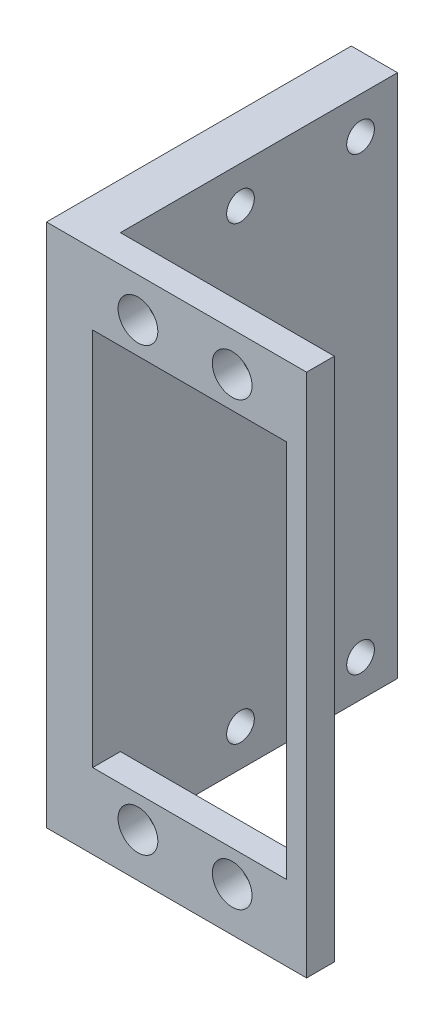
ISO-10303-21;
HEADER;
FILE_DESCRIPTION(('STEP AP214'),'2;1');
FILE_NAME('part.step','',(''),(''),'','','');
FILE_SCHEMA(('AUTOMOTIVE_DESIGN { 1 0 10303 214 1 1 1 1 }'));
ENDSEC;
DATA;
#1=APPLICATION_CONTEXT('core data for automotive mechanical design processes');
#2=APPLICATION_PROTOCOL_DEFINITION('international standard','automotive_design',2000,#1);
#3=PRODUCT_CONTEXT('',#1,'mechanical');
#4=PRODUCT('Part','Part','',(#3));
#5=PRODUCT_RELATED_PRODUCT_CATEGORY('part','',(#4));
#6=PRODUCT_DEFINITION_FORMATION('','',#4);
#7=PRODUCT_DEFINITION_CONTEXT('part definition',#1,'design');
#8=PRODUCT_DEFINITION('design','',#6,#7);
#9=PRODUCT_DEFINITION_SHAPE('','',#8);
#10=(LENGTH_UNIT() NAMED_UNIT(*) SI_UNIT(.MILLI.,.METRE.));
#11=(NAMED_UNIT(*) PLANE_ANGLE_UNIT() SI_UNIT($,.RADIAN.));
#12=(NAMED_UNIT(*) SI_UNIT($,.STERADIAN.) SOLID_ANGLE_UNIT());
#13=UNCERTAINTY_MEASURE_WITH_UNIT(LENGTH_MEASURE(1.E-05),#10,'distance_accuracy_value','');
#14=(GEOMETRIC_REPRESENTATION_CONTEXT(3) GLOBAL_UNCERTAINTY_ASSIGNED_CONTEXT((#13)) GLOBAL_UNIT_ASSIGNED_CONTEXT((#10,
#11,#12)) REPRESENTATION_CONTEXT('',''));
#15=CARTESIAN_POINT('',(0.,0.,0.));
#16=DIRECTION('',(0.,0.,1.));
#17=DIRECTION('',(1.,0.,0.));
#18=AXIS2_PLACEMENT_3D('',#15,#16,#17);
#19=CARTESIAN_POINT('',(-11.4535216616645,17.6096788638023,3.));
#20=DIRECTION('',(0.,-1.,0.));
#21=DIRECTION('',(0.,0.,-1.));
#22=AXIS2_PLACEMENT_3D('',#19,#20,#21);
#23=PLANE('',#22);
#24=DIRECTION('',(-1.,0.,0.));
#25=VECTOR('',#24,1.);
#26=CARTESIAN_POINT('',(-11.4535216616645,17.6096788638023,0.));
#27=LINE('',#26,#25);
#28=CARTESIAN_POINT('',(11.7043655919531,17.6096788638023,0.));
#29=VERTEX_POINT('',#28);
#30=CARTESIAN_POINT('',(-11.4535216616645,17.6096788638023,0.));
#31=VERTEX_POINT('',#30);
#32=EDGE_CURVE('E90',#29,#31,#27,.T.);
#33=ORIENTED_EDGE('',*,*,#32,.T.);
#34=DIRECTION('',(0.,0.,-1.));
#35=VECTOR('',#34,1.);
#36=CARTESIAN_POINT('',(-11.4535216616645,17.6096788638023,3.));
#37=LINE('',#36,#35);
#38=CARTESIAN_POINT('',(-11.4535216616645,17.6096788638023,-30.));
#39=VERTEX_POINT('',#38);
#40=EDGE_CURVE('E172',#31,#39,#37,.T.);
#41=ORIENTED_EDGE('',*,*,#40,.T.);
#42=DIRECTION('',(1.,0.,0.));
#43=VECTOR('',#42,1.);
#44=CARTESIAN_POINT('',(-11.4535216616645,17.6096788638023,-30.));
#45=LINE('',#44,#43);
#46=CARTESIAN_POINT('',(-16.4535216616645,17.6096788638023,-30.));
#47=VERTEX_POINT('',#46);
#48=EDGE_CURVE('E162',#47,#39,#45,.T.);
#49=ORIENTED_EDGE('',*,*,#48,.F.);
#50=DIRECTION('',(0.,0.,-1.));
#51=VECTOR('',#50,1.);
#52=CARTESIAN_POINT('',(-16.4535216616645,17.6096788638023,3.));
#53=LINE('',#52,#51);
#54=CARTESIAN_POINT('',(-16.4535216616645,17.6096788638023,3.));
#55=VERTEX_POINT('',#54);
#56=EDGE_CURVE('E175',#55,#47,#53,.T.);
#57=ORIENTED_EDGE('',*,*,#56,.F.);
#58=DIRECTION('',(-1.,0.,0.));
#59=VECTOR('',#58,1.);
#60=CARTESIAN_POINT('',(-11.4535216616645,17.6096788638023,3.));
#61=LINE('',#60,#59);
#62=CARTESIAN_POINT('',(11.7043655919531,17.6096788638023,3.));
#63=VERTEX_POINT('',#62);
#64=EDGE_CURVE('E84',#63,#55,#61,.T.);
#65=ORIENTED_EDGE('',*,*,#64,.F.);
#66=DIRECTION('',(0.,0.,-1.));
#67=VECTOR('',#66,1.);
#68=CARTESIAN_POINT('',(11.7043655919531,17.6096788638023,3.));
#69=LINE('',#68,#67);
#70=EDGE_CURVE('E79',#63,#29,#69,.T.);
#71=ORIENTED_EDGE('',*,*,#70,.T.);
#72=EDGE_LOOP('',(#33,#41,#49,#57,#65,#71));
#73=FACE_BOUND('',#72,.T.);
#74=ADVANCED_FACE('F32',(#73),#23,.F.);
#75=CARTESIAN_POINT('',(-11.4535216616645,-39.1935902800227,3.));
#76=DIRECTION('',(0.,1.,0.));
#77=DIRECTION('',(0.,0.,1.));
#78=AXIS2_PLACEMENT_3D('',#75,#76,#77);
#79=PLANE('',#78);
#80=DIRECTION('',(1.,0.,0.));
#81=VECTOR('',#80,1.);
#82=CARTESIAN_POINT('',(-11.4535216616645,-39.1935902800227,0.));
#83=LINE('',#82,#81);
#84=CARTESIAN_POINT('',(-11.4535216616645,-39.1935902800227,0.));
#85=VERTEX_POINT('',#84);
#86=CARTESIAN_POINT('',(11.7043655919531,-39.1935902800227,0.));
#87=VERTEX_POINT('',#86);
#88=EDGE_CURVE('E85',#85,#87,#83,.T.);
#89=ORIENTED_EDGE('',*,*,#88,.T.);
#90=DIRECTION('',(0.,0.,-1.));
#91=VECTOR('',#90,1.);
#92=CARTESIAN_POINT('',(11.7043655919531,-39.1935902800227,3.));
#93=LINE('',#92,#91);
#94=CARTESIAN_POINT('',(11.7043655919531,-39.1935902800227,3.));
#95=VERTEX_POINT('',#94);
#96=EDGE_CURVE('E40',#95,#87,#93,.T.);
#97=ORIENTED_EDGE('',*,*,#96,.F.);
#98=DIRECTION('',(1.,0.,0.));
#99=VECTOR('',#98,1.);
#100=CARTESIAN_POINT('',(-11.4535216616645,-39.1935902800227,3.));
#101=LINE('',#100,#99);
#102=CARTESIAN_POINT('',(-16.4535216616645,-39.1935902800227,3.));
#103=VERTEX_POINT('',#102);
#104=EDGE_CURVE('E201',#103,#95,#101,.T.);
#105=ORIENTED_EDGE('',*,*,#104,.F.);
#106=DIRECTION('',(0.,0.,-1.));
#107=VECTOR('',#106,1.);
#108=CARTESIAN_POINT('',(-16.4535216616645,-39.1935902800227,3.));
#109=LINE('',#108,#107);
#110=CARTESIAN_POINT('',(-16.4535216616645,-39.1935902800227,-30.));
#111=VERTEX_POINT('',#110);
#112=EDGE_CURVE('E178',#103,#111,#109,.T.);
#113=ORIENTED_EDGE('',*,*,#112,.T.);
#114=DIRECTION('',(-1.,0.,0.));
#115=VECTOR('',#114,1.);
#116=CARTESIAN_POINT('',(-11.4535216616645,-39.1935902800227,-30.));
#117=LINE('',#116,#115);
#118=CARTESIAN_POINT('',(-11.4535216616645,-39.1935902800227,-30.));
#119=VERTEX_POINT('',#118);
#120=EDGE_CURVE('E156',#119,#111,#117,.T.);
#121=ORIENTED_EDGE('',*,*,#120,.F.);
#122=DIRECTION('',(0.,0.,-1.));
#123=VECTOR('',#122,1.);
#124=CARTESIAN_POINT('',(-11.4535216616645,-39.1935902800227,3.));
#125=LINE('',#124,#123);
#126=EDGE_CURVE('E171',#85,#119,#125,.T.);
#127=ORIENTED_EDGE('',*,*,#126,.F.);
#128=EDGE_LOOP('',(#89,#97,#105,#113,#121,#127));
#129=FACE_BOUND('',#128,.T.);
#130=ADVANCED_FACE('F208',(#129),#79,.F.);
#131=CARTESIAN_POINT('',(11.7043655919531,17.6096788638023,3.));
#132=DIRECTION('',(-1.,0.,0.));
#133=DIRECTION('',(0.,-1.,0.));
#134=AXIS2_PLACEMENT_3D('',#131,#132,#133);
#135=PLANE('',#134);
#136=DIRECTION('',(0.,1.,0.));
#137=VECTOR('',#136,1.);
#138=CARTESIAN_POINT('',(11.7043655919531,17.6096788638023,0.));
#139=LINE('',#138,#137);
#140=EDGE_CURVE('E76',#87,#29,#139,.T.);
#141=ORIENTED_EDGE('',*,*,#140,.T.);
#142=ORIENTED_EDGE('',*,*,#70,.F.);
#143=DIRECTION('',(0.,1.,0.));
#144=VECTOR('',#143,1.);
#145=CARTESIAN_POINT('',(11.7043655919531,17.6096788638023,3.));
#146=LINE('',#145,#144);
#147=EDGE_CURVE('E57',#95,#63,#146,.T.);
#148=ORIENTED_EDGE('',*,*,#147,.F.);
#149=ORIENTED_EDGE('',*,*,#96,.T.);
#150=EDGE_LOOP('',(#141,#142,#148,#149));
#151=FACE_BOUND('',#150,.T.);
#152=ADVANCED_FACE('F78',(#151),#135,.F.);
#153=CARTESIAN_POINT('',(0.,0.,3.));
#154=DIRECTION('',(0.,0.,-1.));
#155=DIRECTION('',(-1.,0.,0.));
#156=AXIS2_PLACEMENT_3D('',#153,#154,#155);
#157=PLANE('',#156);
#158=CARTESIAN_POINT('',(-6.55352166166445,13.3725715818765,3.));
#159=DIRECTION('',(0.,0.,-1.));
#160=DIRECTION('',(-1.,0.,0.));
#161=AXIS2_PLACEMENT_3D('',#158,#159,#160);
#162=CIRCLE('',#161,2.15);
#163=CARTESIAN_POINT('',(-8.70352166166446,13.3725715818765,3.));
#164=VERTEX_POINT('',#163);
#165=EDGE_CURVE('E150',#164,#164,#162,.T.);
#166=ORIENTED_EDGE('',*,*,#165,.T.);
#167=EDGE_LOOP('',(#166));
#168=FACE_BOUND('',#167,.T.);
#169=CARTESIAN_POINT('',(3.64647833833554,-34.4274284181235,3.));
#170=DIRECTION('',(0.,0.,-1.));
#171=DIRECTION('',(-1.,0.,0.));
#172=AXIS2_PLACEMENT_3D('',#169,#170,#171);
#173=CIRCLE('',#172,2.15);
#174=CARTESIAN_POINT('',(1.49647833833555,-34.4274284181235,3.));
#175=VERTEX_POINT('',#174);
#176=EDGE_CURVE('E147',#175,#175,#173,.T.);
#177=ORIENTED_EDGE('',*,*,#176,.T.);
#178=EDGE_LOOP('',(#177));
#179=FACE_BOUND('',#178,.T.);
#180=CARTESIAN_POINT('',(-6.55352166166446,-34.4274284181235,3.));
#181=DIRECTION('',(0.,0.,-1.));
#182=DIRECTION('',(-1.,0.,0.));
#183=AXIS2_PLACEMENT_3D('',#180,#181,#182);
#184=CIRCLE('',#183,2.15);
#185=CARTESIAN_POINT('',(-8.70352166166445,-34.4274284181235,3.));
#186=VERTEX_POINT('',#185);
#187=EDGE_CURVE('E144',#186,#186,#184,.T.);
#188=ORIENTED_EDGE('',*,*,#187,.T.);
#189=EDGE_LOOP('',(#188));
#190=FACE_BOUND('',#189,.T.);
#191=CARTESIAN_POINT('',(3.64647833833554,13.3725715818765,3.));
#192=DIRECTION('',(0.,0.,-1.));
#193=DIRECTION('',(-1.,0.,0.));
#194=AXIS2_PLACEMENT_3D('',#191,#192,#193);
#195=CIRCLE('',#194,2.15);
#196=CARTESIAN_POINT('',(1.49647833833554,13.3725715818765,3.));
#197=VERTEX_POINT('',#196);
#198=EDGE_CURVE('E141',#197,#197,#195,.T.);
#199=ORIENTED_EDGE('',*,*,#198,.T.);
#200=EDGE_LOOP('',(#199));
#201=FACE_BOUND('',#200,.T.);
#202=DIRECTION('',(0.,-1.,0.));
#203=VECTOR('',#202,1.);
#204=CARTESIAN_POINT('',(-11.4535216616645,-39.1935902800227,3.));
#205=LINE('',#204,#203);
#206=CARTESIAN_POINT('',(-11.4535216616645,9.98681562195004,3.));
#207=VERTEX_POINT('',#206);
#208=CARTESIAN_POINT('',(-11.4535216616645,-31.041672458197,3.));
#209=VERTEX_POINT('',#208);
#210=EDGE_CURVE('E165',#207,#209,#205,.T.);
#211=ORIENTED_EDGE('',*,*,#210,.F.);
#212=DIRECTION('',(-1.,0.,0.));
#213=VECTOR('',#212,1.);
#214=CARTESIAN_POINT('',(9.52875763391757,9.98681562195004,3.));
#215=LINE('',#214,#213);
#216=CARTESIAN_POINT('',(9.52875763391757,9.98681562195004,3.));
#217=VERTEX_POINT('',#216);
#218=EDGE_CURVE('E185',#217,#207,#215,.T.);
#219=ORIENTED_EDGE('',*,*,#218,.F.);
#220=DIRECTION('',(0.,1.,0.));
#221=VECTOR('',#220,1.);
#222=CARTESIAN_POINT('',(9.52875763391757,-31.041672458197,3.));
#223=LINE('',#222,#221);
#224=CARTESIAN_POINT('',(9.52875763391757,-31.041672458197,3.));
#225=VERTEX_POINT('',#224);
#226=EDGE_CURVE('E190',#225,#217,#223,.T.);
#227=ORIENTED_EDGE('',*,*,#226,.F.);
#228=DIRECTION('',(1.,0.,0.));
#229=VECTOR('',#228,1.);
#230=CARTESIAN_POINT('',(9.52875763391757,-31.041672458197,3.));
#231=LINE('',#230,#229);
#232=EDGE_CURVE('E174',#209,#225,#231,.T.);
#233=ORIENTED_EDGE('',*,*,#232,.F.);
#234=EDGE_LOOP('',(#211,#219,#227,#233));
#235=FACE_BOUND('',#234,.T.);
#236=ORIENTED_EDGE('',*,*,#64,.T.);
#237=DIRECTION('',(0.,1.,0.));
#238=VECTOR('',#237,1.);
#239=CARTESIAN_POINT('',(-16.4535216616645,-39.1935902800227,3.));
#240=LINE('',#239,#238);
#241=EDGE_CURVE('E168',#103,#55,#240,.T.);
#242=ORIENTED_EDGE('',*,*,#241,.F.);
#243=ORIENTED_EDGE('',*,*,#104,.T.);
#244=ORIENTED_EDGE('',*,*,#147,.T.);
#245=EDGE_LOOP('',(#236,#242,#243,#244));
#246=FACE_BOUND('',#245,.T.);
#247=ADVANCED_FACE('F204',(#168,#179,#190,#201,#235,#246),#157,.F.);
#248=CARTESIAN_POINT('',(0.,0.,0.));
#249=DIRECTION('',(0.,0.,-1.));
#250=DIRECTION('',(-1.,0.,0.));
#251=AXIS2_PLACEMENT_3D('',#248,#249,#250);
#252=PLANE('',#251);
#253=CARTESIAN_POINT('',(-6.55352166166445,13.3725715818765,0.));
#254=DIRECTION('',(0.,0.,-1.));
#255=DIRECTION('',(-1.,0.,0.));
#256=AXIS2_PLACEMENT_3D('',#253,#254,#255);
#257=CIRCLE('',#256,2.15);
#258=CARTESIAN_POINT('',(-8.70352166166446,13.3725715818765,0.));
#259=VERTEX_POINT('',#258);
#260=EDGE_CURVE('E131',#259,#259,#257,.T.);
#261=ORIENTED_EDGE('',*,*,#260,.F.);
#262=EDGE_LOOP('',(#261));
#263=FACE_BOUND('',#262,.T.);
#264=CARTESIAN_POINT('',(3.64647833833554,-34.4274284181235,0.));
#265=DIRECTION('',(0.,0.,-1.));
#266=DIRECTION('',(-1.,0.,0.));
#267=AXIS2_PLACEMENT_3D('',#264,#265,#266);
#268=CIRCLE('',#267,2.15);
#269=CARTESIAN_POINT('',(1.49647833833555,-34.4274284181235,0.));
#270=VERTEX_POINT('',#269);
#271=EDGE_CURVE('E126',#270,#270,#268,.T.);
#272=ORIENTED_EDGE('',*,*,#271,.F.);
#273=EDGE_LOOP('',(#272));
#274=FACE_BOUND('',#273,.T.);
#275=CARTESIAN_POINT('',(-6.55352166166446,-34.4274284181235,0.));
#276=DIRECTION('',(0.,0.,-1.));
#277=DIRECTION('',(-1.,0.,0.));
#278=AXIS2_PLACEMENT_3D('',#275,#276,#277);
#279=CIRCLE('',#278,2.15);
#280=CARTESIAN_POINT('',(-8.70352166166445,-34.4274284181235,0.));
#281=VERTEX_POINT('',#280);
#282=EDGE_CURVE('E122',#281,#281,#279,.T.);
#283=ORIENTED_EDGE('',*,*,#282,.F.);
#284=EDGE_LOOP('',(#283));
#285=FACE_BOUND('',#284,.T.);
#286=CARTESIAN_POINT('',(3.64647833833554,13.3725715818765,0.));
#287=DIRECTION('',(0.,0.,-1.));
#288=DIRECTION('',(-1.,0.,0.));
#289=AXIS2_PLACEMENT_3D('',#286,#287,#288);
#290=CIRCLE('',#289,2.15);
#291=CARTESIAN_POINT('',(1.49647833833554,13.3725715818765,0.));
#292=VERTEX_POINT('',#291);
#293=EDGE_CURVE('E137',#292,#292,#290,.T.);
#294=ORIENTED_EDGE('',*,*,#293,.F.);
#295=EDGE_LOOP('',(#294));
#296=FACE_BOUND('',#295,.T.);
#297=DIRECTION('',(-1.,0.,0.));
#298=VECTOR('',#297,1.);
#299=CARTESIAN_POINT('',(9.52875763391757,9.98681562195004,0.));
#300=LINE('',#299,#298);
#301=CARTESIAN_POINT('',(9.52875763391757,9.98681562195004,0.));
#302=VERTEX_POINT('',#301);
#303=CARTESIAN_POINT('',(-11.4535216616645,9.98681562195004,0.));
#304=VERTEX_POINT('',#303);
#305=EDGE_CURVE('E184',#302,#304,#300,.T.);
#306=ORIENTED_EDGE('',*,*,#305,.T.);
#307=DIRECTION('',(0.,-1.,0.));
#308=VECTOR('',#307,1.);
#309=CARTESIAN_POINT('',(-11.4535216616645,-39.1935902800227,0.));
#310=LINE('',#309,#308);
#311=EDGE_CURVE('E97',#31,#304,#310,.T.);
#312=ORIENTED_EDGE('',*,*,#311,.F.);
#313=ORIENTED_EDGE('',*,*,#32,.F.);
#314=ORIENTED_EDGE('',*,*,#140,.F.);
#315=ORIENTED_EDGE('',*,*,#88,.F.);
#316=CARTESIAN_POINT('',(-11.4535216616645,-31.041672458197,0.));
#317=VERTEX_POINT('',#316);
#318=EDGE_CURVE('E98',#317,#85,#310,.T.);
#319=ORIENTED_EDGE('',*,*,#318,.F.);
#320=DIRECTION('',(-1.,0.,0.));
#321=VECTOR('',#320,1.);
#322=CARTESIAN_POINT('',(0.,-31.041672458197,0.));
#323=LINE('',#322,#321);
#324=CARTESIAN_POINT('',(9.52875763391757,-31.041672458197,0.));
#325=VERTEX_POINT('',#324);
#326=EDGE_CURVE('E11',#325,#317,#323,.T.);
#327=ORIENTED_EDGE('',*,*,#326,.F.);
#328=DIRECTION('',(0.,1.,0.));
#329=VECTOR('',#328,1.);
#330=CARTESIAN_POINT('',(9.52875763391757,-31.041672458197,0.));
#331=LINE('',#330,#329);
#332=EDGE_CURVE('E48',#325,#302,#331,.T.);
#333=ORIENTED_EDGE('',*,*,#332,.T.);
#334=EDGE_LOOP('',(#306,#312,#313,#314,#315,#319,#327,#333));
#335=FACE_BOUND('',#334,.T.);
#336=ADVANCED_FACE('F95',(#263,#274,#285,#296,#335),#252,.T.);
#337=CARTESIAN_POINT('',(9.52875763391757,9.98681562195004,0.));
#338=DIRECTION('',(0.,1.,0.));
#339=DIRECTION('',(-1.,0.,0.));
#340=AXIS2_PLACEMENT_3D('',#337,#338,#339);
#341=PLANE('',#340);
#342=ORIENTED_EDGE('',*,*,#305,.F.);
#343=DIRECTION('',(0.,0.,1.));
#344=VECTOR('',#343,1.);
#345=CARTESIAN_POINT('',(9.52875763391757,9.98681562195004,0.));
#346=LINE('',#345,#344);
#347=EDGE_CURVE('E195',#302,#217,#346,.T.);
#348=ORIENTED_EDGE('',*,*,#347,.T.);
#349=ORIENTED_EDGE('',*,*,#218,.T.);
#350=DIRECTION('',(0.,0.,1.));
#351=VECTOR('',#350,1.);
#352=CARTESIAN_POINT('',(-11.4535216616645,9.98681562195004,3.));
#353=LINE('',#352,#351);
#354=EDGE_CURVE('E99',#304,#207,#353,.T.);
#355=ORIENTED_EDGE('',*,*,#354,.F.);
#356=EDGE_LOOP('',(#342,#348,#349,#355));
#357=FACE_BOUND('',#356,.T.);
#358=ADVANCED_FACE('F240',(#357),#341,.F.);
#359=CARTESIAN_POINT('',(9.52875763391757,-31.041672458197,0.));
#360=DIRECTION('',(0.,-1.,0.));
#361=DIRECTION('',(1.,0.,0.));
#362=AXIS2_PLACEMENT_3D('',#359,#360,#361);
#363=PLANE('',#362);
#364=ORIENTED_EDGE('',*,*,#232,.T.);
#365=DIRECTION('',(0.,0.,1.));
#366=VECTOR('',#365,1.);
#367=CARTESIAN_POINT('',(9.52875763391757,-31.041672458197,0.));
#368=LINE('',#367,#366);
#369=EDGE_CURVE('E187',#325,#225,#368,.T.);
#370=ORIENTED_EDGE('',*,*,#369,.F.);
#371=ORIENTED_EDGE('',*,*,#326,.T.);
#372=DIRECTION('',(0.,0.,-1.));
#373=VECTOR('',#372,1.);
#374=CARTESIAN_POINT('',(-11.4535216616645,-31.041672458197,3.));
#375=LINE('',#374,#373);
#376=EDGE_CURVE('E104',#209,#317,#375,.T.);
#377=ORIENTED_EDGE('',*,*,#376,.F.);
#378=EDGE_LOOP('',(#364,#370,#371,#377));
#379=FACE_BOUND('',#378,.T.);
#380=ADVANCED_FACE('F226',(#379),#363,.F.);
#381=CARTESIAN_POINT('',(9.52875763391757,-31.041672458197,0.));
#382=DIRECTION('',(1.,0.,0.));
#383=DIRECTION('',(0.,0.,-1.));
#384=AXIS2_PLACEMENT_3D('',#381,#382,#383);
#385=PLANE('',#384);
#386=ORIENTED_EDGE('',*,*,#226,.T.);
#387=ORIENTED_EDGE('',*,*,#347,.F.);
#388=ORIENTED_EDGE('',*,*,#332,.F.);
#389=ORIENTED_EDGE('',*,*,#369,.T.);
#390=EDGE_LOOP('',(#386,#387,#388,#389));
#391=FACE_BOUND('',#390,.T.);
#392=ADVANCED_FACE('F234',(#391),#385,.F.);
#393=CARTESIAN_POINT('',(-11.4535216616645,-39.1935902800227,3.));
#394=DIRECTION('',(1.,0.,0.));
#395=DIRECTION('',(0.,0.,-1.));
#396=AXIS2_PLACEMENT_3D('',#393,#394,#395);
#397=PLANE('',#396);
#398=CARTESIAN_POINT('',(-11.4535216616645,13.6096788638023,-13.));
#399=DIRECTION('',(1.,0.,0.));
#400=DIRECTION('',(0.,0.,-1.));
#401=AXIS2_PLACEMENT_3D('',#398,#399,#400);
#402=CIRCLE('',#401,1.5);
#403=CARTESIAN_POINT('',(-11.4535216616645,13.6096788638023,-14.5));
#404=VERTEX_POINT('',#403);
#405=EDGE_CURVE('E461',#404,#404,#402,.T.);
#406=ORIENTED_EDGE('',*,*,#405,.F.);
#407=EDGE_LOOP('',(#406));
#408=FACE_BOUND('',#407,.T.);
#409=CARTESIAN_POINT('',(-11.4535216616645,-35.1935902800227,-26.));
#410=DIRECTION('',(1.,0.,0.));
#411=DIRECTION('',(0.,0.,1.));
#412=AXIS2_PLACEMENT_3D('',#409,#410,#411);
#413=CIRCLE('',#412,1.5);
#414=CARTESIAN_POINT('',(-11.4535216616645,-35.1935902800227,-24.5));
#415=VERTEX_POINT('',#414);
#416=EDGE_CURVE('E462',#415,#415,#413,.T.);
#417=ORIENTED_EDGE('',*,*,#416,.F.);
#418=EDGE_LOOP('',(#417));
#419=FACE_BOUND('',#418,.T.);
#420=CARTESIAN_POINT('',(-11.4535216616645,-35.1935902800227,-13.));
#421=DIRECTION('',(1.,0.,0.));
#422=DIRECTION('',(0.,0.,1.));
#423=AXIS2_PLACEMENT_3D('',#420,#421,#422);
#424=CIRCLE('',#423,1.5);
#425=CARTESIAN_POINT('',(-11.4535216616645,-35.1935902800227,-11.5));
#426=VERTEX_POINT('',#425);
#427=EDGE_CURVE('E466',#426,#426,#424,.T.);
#428=ORIENTED_EDGE('',*,*,#427,.F.);
#429=EDGE_LOOP('',(#428));
#430=FACE_BOUND('',#429,.T.);
#431=CARTESIAN_POINT('',(-11.4535216616645,13.6096788638023,-26.));
#432=DIRECTION('',(1.,0.,0.));
#433=DIRECTION('',(0.,0.,-1.));
#434=AXIS2_PLACEMENT_3D('',#431,#432,#433);
#435=CIRCLE('',#434,1.5);
#436=CARTESIAN_POINT('',(-11.4535216616645,13.6096788638023,-27.5));
#437=VERTEX_POINT('',#436);
#438=EDGE_CURVE('E115',#437,#437,#435,.T.);
#439=ORIENTED_EDGE('',*,*,#438,.F.);
#440=EDGE_LOOP('',(#439));
#441=FACE_BOUND('',#440,.T.);
#442=ORIENTED_EDGE('',*,*,#40,.F.);
#443=ORIENTED_EDGE('',*,*,#311,.T.);
#444=ORIENTED_EDGE('',*,*,#354,.T.);
#445=ORIENTED_EDGE('',*,*,#210,.T.);
#446=ORIENTED_EDGE('',*,*,#376,.T.);
#447=ORIENTED_EDGE('',*,*,#318,.T.);
#448=ORIENTED_EDGE('',*,*,#126,.T.);
#449=DIRECTION('',(0.,-1.,0.));
#450=VECTOR('',#449,1.);
#451=CARTESIAN_POINT('',(-11.4535216616645,-39.1935902800227,-30.));
#452=LINE('',#451,#450);
#453=EDGE_CURVE('E153',#39,#119,#452,.T.);
#454=ORIENTED_EDGE('',*,*,#453,.F.);
#455=EDGE_LOOP('',(#442,#443,#444,#445,#446,#447,#448,#454));
#456=FACE_BOUND('',#455,.T.);
#457=ADVANCED_FACE('F215',(#408,#419,#430,#441,#456),#397,.T.);
#458=CARTESIAN_POINT('',(-16.4535216616645,-39.1935902800227,3.));
#459=DIRECTION('',(-1.,0.,0.));
#460=DIRECTION('',(0.,0.,1.));
#461=AXIS2_PLACEMENT_3D('',#458,#459,#460);
#462=PLANE('',#461);
#463=CARTESIAN_POINT('',(-16.4535216616645,13.6096788638023,-13.));
#464=DIRECTION('',(-1.,0.,0.));
#465=DIRECTION('',(0.,0.,1.));
#466=AXIS2_PLACEMENT_3D('',#463,#464,#465);
#467=CIRCLE('',#466,1.5);
#468=CARTESIAN_POINT('',(-16.4535216616645,13.6096788638023,-11.5));
#469=VERTEX_POINT('',#468);
#470=EDGE_CURVE('E35',#469,#469,#467,.T.);
#471=ORIENTED_EDGE('',*,*,#470,.F.);
#472=EDGE_LOOP('',(#471));
#473=FACE_BOUND('',#472,.T.);
#474=CARTESIAN_POINT('',(-16.4535216616645,-35.1935902800227,-26.));
#475=DIRECTION('',(-1.,0.,0.));
#476=DIRECTION('',(0.,0.,1.));
#477=AXIS2_PLACEMENT_3D('',#474,#475,#476);
#478=CIRCLE('',#477,1.5);
#479=CARTESIAN_POINT('',(-16.4535216616645,-35.1935902800227,-24.5));
#480=VERTEX_POINT('',#479);
#481=EDGE_CURVE('E117',#480,#480,#478,.T.);
#482=ORIENTED_EDGE('',*,*,#481,.F.);
#483=EDGE_LOOP('',(#482));
#484=FACE_BOUND('',#483,.T.);
#485=CARTESIAN_POINT('',(-16.4535216616645,-35.1935902800227,-13.));
#486=DIRECTION('',(-1.,0.,0.));
#487=DIRECTION('',(0.,0.,1.));
#488=AXIS2_PLACEMENT_3D('',#485,#486,#487);
#489=CIRCLE('',#488,1.5);
#490=CARTESIAN_POINT('',(-16.4535216616645,-35.1935902800227,-11.5));
#491=VERTEX_POINT('',#490);
#492=EDGE_CURVE('E114',#491,#491,#489,.T.);
#493=ORIENTED_EDGE('',*,*,#492,.F.);
#494=EDGE_LOOP('',(#493));
#495=FACE_BOUND('',#494,.T.);
#496=CARTESIAN_POINT('',(-16.4535216616645,13.6096788638023,-26.));
#497=DIRECTION('',(-1.,0.,0.));
#498=DIRECTION('',(0.,0.,1.));
#499=AXIS2_PLACEMENT_3D('',#496,#497,#498);
#500=CIRCLE('',#499,1.5);
#501=CARTESIAN_POINT('',(-16.4535216616645,13.6096788638023,-24.5));
#502=VERTEX_POINT('',#501);
#503=EDGE_CURVE('E111',#502,#502,#500,.T.);
#504=ORIENTED_EDGE('',*,*,#503,.F.);
#505=EDGE_LOOP('',(#504));
#506=FACE_BOUND('',#505,.T.);
#507=ORIENTED_EDGE('',*,*,#56,.T.);
#508=DIRECTION('',(0.,1.,0.));
#509=VECTOR('',#508,1.);
#510=CARTESIAN_POINT('',(-16.4535216616645,-39.1935902800227,-30.));
#511=LINE('',#510,#509);
#512=EDGE_CURVE('E159',#111,#47,#511,.T.);
#513=ORIENTED_EDGE('',*,*,#512,.F.);
#514=ORIENTED_EDGE('',*,*,#112,.F.);
#515=ORIENTED_EDGE('',*,*,#241,.T.);
#516=EDGE_LOOP('',(#507,#513,#514,#515));
#517=FACE_BOUND('',#516,.T.);
#518=ADVANCED_FACE('F251',(#473,#484,#495,#506,#517),#462,.T.);
#519=CARTESIAN_POINT('',(0.,0.,-30.));
#520=DIRECTION('',(0.,0.,1.));
#521=DIRECTION('',(1.,0.,0.));
#522=AXIS2_PLACEMENT_3D('',#519,#520,#521);
#523=PLANE('',#522);
#524=ORIENTED_EDGE('',*,*,#453,.T.);
#525=ORIENTED_EDGE('',*,*,#120,.T.);
#526=ORIENTED_EDGE('',*,*,#512,.T.);
#527=ORIENTED_EDGE('',*,*,#48,.T.);
#528=EDGE_LOOP('',(#524,#525,#526,#527));
#529=FACE_BOUND('',#528,.T.);
#530=ADVANCED_FACE('F246',(#529),#523,.F.);
#531=CARTESIAN_POINT('',(3.64647833833554,13.3725715818765,10.));
#532=DIRECTION('',(0.,0.,-1.));
#533=DIRECTION('',(-1.,0.,0.));
#534=AXIS2_PLACEMENT_3D('',#531,#532,#533);
#535=CYLINDRICAL_SURFACE('',#534,2.15);
#536=ORIENTED_EDGE('',*,*,#293,.T.);
#537=EDGE_LOOP('',(#536));
#538=FACE_BOUND('',#537,.T.);
#539=ORIENTED_EDGE('',*,*,#198,.F.);
#540=EDGE_LOOP('',(#539));
#541=FACE_BOUND('',#540,.T.);
#542=ADVANCED_FACE('F265',(#538,#541),#535,.F.);
#543=CARTESIAN_POINT('',(-6.55352166166446,-34.4274284181235,10.));
#544=DIRECTION('',(0.,0.,-1.));
#545=DIRECTION('',(-1.,0.,0.));
#546=AXIS2_PLACEMENT_3D('',#543,#544,#545);
#547=CYLINDRICAL_SURFACE('',#546,2.15);
#548=ORIENTED_EDGE('',*,*,#282,.T.);
#549=EDGE_LOOP('',(#548));
#550=FACE_BOUND('',#549,.T.);
#551=ORIENTED_EDGE('',*,*,#187,.F.);
#552=EDGE_LOOP('',(#551));
#553=FACE_BOUND('',#552,.T.);
#554=ADVANCED_FACE('F364',(#550,#553),#547,.F.);
#555=CARTESIAN_POINT('',(3.64647833833554,-34.4274284181235,10.));
#556=DIRECTION('',(0.,0.,-1.));
#557=DIRECTION('',(-1.,0.,0.));
#558=AXIS2_PLACEMENT_3D('',#555,#556,#557);
#559=CYLINDRICAL_SURFACE('',#558,2.15);
#560=ORIENTED_EDGE('',*,*,#271,.T.);
#561=EDGE_LOOP('',(#560));
#562=FACE_BOUND('',#561,.T.);
#563=ORIENTED_EDGE('',*,*,#176,.F.);
#564=EDGE_LOOP('',(#563));
#565=FACE_BOUND('',#564,.T.);
#566=ADVANCED_FACE('F367',(#562,#565),#559,.F.);
#567=CARTESIAN_POINT('',(-6.55352166166445,13.3725715818765,10.));
#568=DIRECTION('',(0.,0.,-1.));
#569=DIRECTION('',(-1.,0.,0.));
#570=AXIS2_PLACEMENT_3D('',#567,#568,#569);
#571=CYLINDRICAL_SURFACE('',#570,2.15);
#572=ORIENTED_EDGE('',*,*,#260,.T.);
#573=EDGE_LOOP('',(#572));
#574=FACE_BOUND('',#573,.T.);
#575=ORIENTED_EDGE('',*,*,#165,.F.);
#576=EDGE_LOOP('',(#575));
#577=FACE_BOUND('',#576,.T.);
#578=ADVANCED_FACE('F315',(#574,#577),#571,.F.);
#579=CARTESIAN_POINT('',(-21.4535216616645,13.6096788638023,-26.));
#580=DIRECTION('',(1.,0.,0.));
#581=DIRECTION('',(0.,0.,-1.));
#582=AXIS2_PLACEMENT_3D('',#579,#580,#581);
#583=CYLINDRICAL_SURFACE('',#582,1.5);
#584=ORIENTED_EDGE('',*,*,#503,.T.);
#585=EDGE_LOOP('',(#584));
#586=FACE_BOUND('',#585,.T.);
#587=ORIENTED_EDGE('',*,*,#438,.T.);
#588=EDGE_LOOP('',(#587));
#589=FACE_BOUND('',#588,.T.);
#590=ADVANCED_FACE('F325',(#586,#589),#583,.F.);
#591=CARTESIAN_POINT('',(-21.4535216616645,-35.1935902800227,-13.));
#592=DIRECTION('',(1.,0.,0.));
#593=DIRECTION('',(0.,0.,-1.));
#594=AXIS2_PLACEMENT_3D('',#591,#592,#593);
#595=CYLINDRICAL_SURFACE('',#594,1.5);
#596=ORIENTED_EDGE('',*,*,#492,.T.);
#597=EDGE_LOOP('',(#596));
#598=FACE_BOUND('',#597,.T.);
#599=ORIENTED_EDGE('',*,*,#427,.T.);
#600=EDGE_LOOP('',(#599));
#601=FACE_BOUND('',#600,.T.);
#602=ADVANCED_FACE('F330',(#598,#601),#595,.F.);
#603=CARTESIAN_POINT('',(-21.4535216616645,-35.1935902800227,-26.));
#604=DIRECTION('',(1.,0.,0.));
#605=DIRECTION('',(0.,0.,-1.));
#606=AXIS2_PLACEMENT_3D('',#603,#604,#605);
#607=CYLINDRICAL_SURFACE('',#606,1.5);
#608=ORIENTED_EDGE('',*,*,#481,.T.);
#609=EDGE_LOOP('',(#608));
#610=FACE_BOUND('',#609,.T.);
#611=ORIENTED_EDGE('',*,*,#416,.T.);
#612=EDGE_LOOP('',(#611));
#613=FACE_BOUND('',#612,.T.);
#614=ADVANCED_FACE('F340',(#610,#613),#607,.F.);
#615=CARTESIAN_POINT('',(-21.4535216616645,13.6096788638023,-13.));
#616=DIRECTION('',(1.,0.,0.));
#617=DIRECTION('',(0.,0.,-1.));
#618=AXIS2_PLACEMENT_3D('',#615,#616,#617);
#619=CYLINDRICAL_SURFACE('',#618,1.5);
#620=ORIENTED_EDGE('',*,*,#470,.T.);
#621=EDGE_LOOP('',(#620));
#622=FACE_BOUND('',#621,.T.);
#623=ORIENTED_EDGE('',*,*,#405,.T.);
#624=EDGE_LOOP('',(#623));
#625=FACE_BOUND('',#624,.T.);
#626=ADVANCED_FACE('F350',(#622,#625),#619,.F.);
#627=CLOSED_SHELL('',(#74,#130,#152,#247,#336,#358,#380,#392,#457,#518,#530,#542,#554,#566,#578,
#590,#602,#614,#626));
#628=MANIFOLD_SOLID_BREP('B2',#627);
#629=ADVANCED_BREP_SHAPE_REPRESENTATION('',(#18,#628),#14);
#630=SHAPE_DEFINITION_REPRESENTATION(#9,#629);
ENDSEC;
END-ISO-10303-21;
